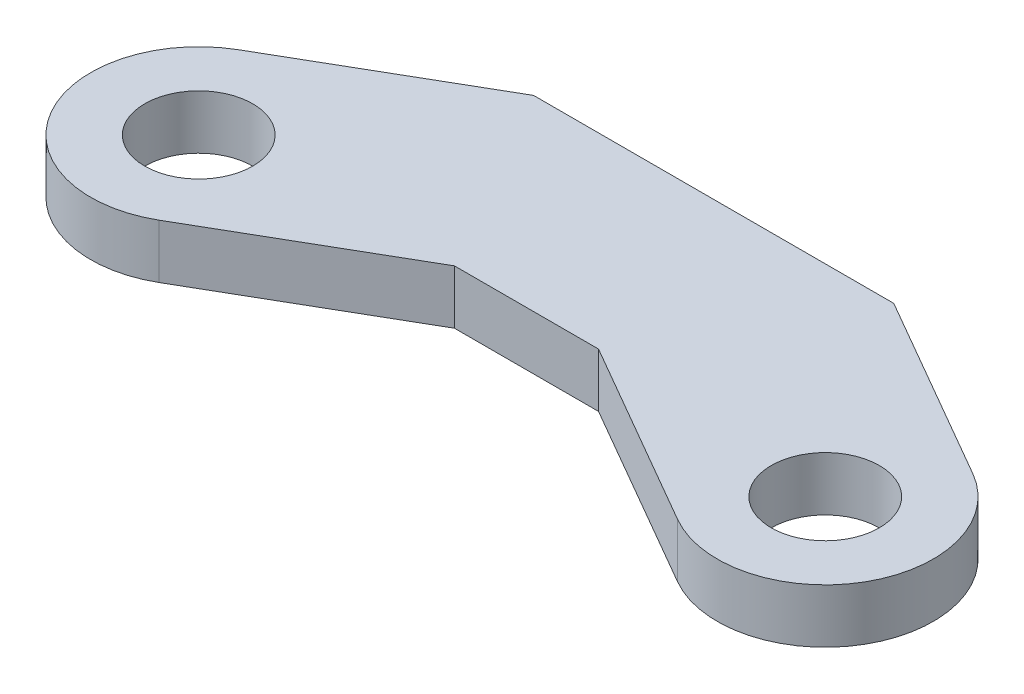
ISO-10303-21;
HEADER;
FILE_DESCRIPTION(('STEP AP214'),'2;1');
FILE_NAME('part.step','',(''),(''),'','','');
FILE_SCHEMA(('AUTOMOTIVE_DESIGN { 1 0 10303 214 1 1 1 1 }'));
ENDSEC;
DATA;
#1=APPLICATION_CONTEXT('core data for automotive mechanical design processes');
#2=APPLICATION_PROTOCOL_DEFINITION('international standard','automotive_design',2000,#1);
#3=PRODUCT_CONTEXT('',#1,'mechanical');
#4=PRODUCT('Part','Part','',(#3));
#5=PRODUCT_RELATED_PRODUCT_CATEGORY('part','',(#4));
#6=PRODUCT_DEFINITION_FORMATION('','',#4);
#7=PRODUCT_DEFINITION_CONTEXT('part definition',#1,'design');
#8=PRODUCT_DEFINITION('design','',#6,#7);
#9=PRODUCT_DEFINITION_SHAPE('','',#8);
#10=(LENGTH_UNIT() NAMED_UNIT(*) SI_UNIT(.MILLI.,.METRE.));
#11=(NAMED_UNIT(*) PLANE_ANGLE_UNIT() SI_UNIT($,.RADIAN.));
#12=(NAMED_UNIT(*) SI_UNIT($,.STERADIAN.) SOLID_ANGLE_UNIT());
#13=UNCERTAINTY_MEASURE_WITH_UNIT(LENGTH_MEASURE(1.E-05),#10,'distance_accuracy_value','');
#14=(GEOMETRIC_REPRESENTATION_CONTEXT(3) GLOBAL_UNCERTAINTY_ASSIGNED_CONTEXT((#13)) GLOBAL_UNIT_ASSIGNED_CONTEXT((#10,
#11,#12)) REPRESENTATION_CONTEXT('',''));
#15=CARTESIAN_POINT('',(0.,0.,0.));
#16=DIRECTION('',(0.,0.,1.));
#17=DIRECTION('',(1.,0.,0.));
#18=AXIS2_PLACEMENT_3D('',#15,#16,#17);
#19=CARTESIAN_POINT('',(5.23205080756885,1.5,7.59807621135335));
#20=DIRECTION('',(0.,1.,0.));
#21=DIRECTION('',(0.,0.,1.));
#22=AXIS2_PLACEMENT_3D('',#19,#20,#21);
#23=PLANE('',#22);
#24=CARTESIAN_POINT('',(5.23205080756885,1.5,7.59807621135335));
#25=DIRECTION('',(0.,1.,0.));
#26=DIRECTION('',(0.,0.,-1.));
#27=AXIS2_PLACEMENT_3D('',#24,#25,#26);
#28=CIRCLE('',#27,1.5);
#29=CARTESIAN_POINT('',(5.23205080756885,1.5,6.09807621135335));
#30=VERTEX_POINT('',#29);
#31=EDGE_CURVE('E135',#30,#30,#28,.T.);
#32=ORIENTED_EDGE('',*,*,#31,.F.);
#33=EDGE_LOOP('',(#32));
#34=FACE_BOUND('',#33,.T.);
#35=DIRECTION('',(-1.,0.,0.));
#36=VECTOR('',#35,1.);
#37=CARTESIAN_POINT('',(-8.46410161513776,1.5,2.00000000000001));
#38=LINE('',#37,#36);
#39=CARTESIAN_POINT('',(1.53589838486224,1.5,2.00000000000001));
#40=VERTEX_POINT('',#39);
#41=CARTESIAN_POINT('',(-8.46410161513776,1.5,2.00000000000001));
#42=VERTEX_POINT('',#41);
#43=EDGE_CURVE('E146',#40,#42,#38,.T.);
#44=ORIENTED_EDGE('',*,*,#43,.T.);
#45=DIRECTION('',(-0.866025403784439,0.,0.5));
#46=VECTOR('',#45,1.);
#47=CARTESIAN_POINT('',(-8.46410161513776,1.5,2.00000000000001));
#48=LINE('',#47,#46);
#49=CARTESIAN_POINT('',(-13.6602540378444,1.5,5.00000000000001));
#50=VERTEX_POINT('',#49);
#51=EDGE_CURVE('E94',#42,#50,#48,.T.);
#52=ORIENTED_EDGE('',*,*,#51,.T.);
#53=CARTESIAN_POINT('',(-12.1602540378444,1.5,7.59807621135335));
#54=DIRECTION('',(0.,1.,0.));
#55=DIRECTION('',(0.,0.,-1.));
#56=AXIS2_PLACEMENT_3D('',#53,#54,#55);
#57=CIRCLE('',#56,3.);
#58=CARTESIAN_POINT('',(-10.6602540378444,1.5,10.1961524227067));
#59=VERTEX_POINT('',#58);
#60=EDGE_CURVE('E161',#50,#59,#57,.T.);
#61=ORIENTED_EDGE('',*,*,#60,.T.);
#62=DIRECTION('',(0.866025403784439,0.,-0.5));
#63=VECTOR('',#62,1.);
#64=CARTESIAN_POINT('',(-5.46410161513776,1.5,7.19615242270664));
#65=LINE('',#64,#63);
#66=CARTESIAN_POINT('',(-5.46410161513776,1.5,7.19615242270664));
#67=VERTEX_POINT('',#66);
#68=EDGE_CURVE('E174',#59,#67,#65,.T.);
#69=ORIENTED_EDGE('',*,*,#68,.T.);
#70=DIRECTION('',(1.,0.,0.));
#71=VECTOR('',#70,1.);
#72=CARTESIAN_POINT('',(-5.46410161513776,1.5,7.19615242270664));
#73=LINE('',#72,#71);
#74=CARTESIAN_POINT('',(-1.46410161513776,1.5,7.19615242270664));
#75=VERTEX_POINT('',#74);
#76=EDGE_CURVE('E113',#67,#75,#73,.T.);
#77=ORIENTED_EDGE('',*,*,#76,.T.);
#78=DIRECTION('',(0.866025403784438,0.,0.500000000000001));
#79=VECTOR('',#78,1.);
#80=CARTESIAN_POINT('',(-1.46410161513776,1.5,7.19615242270664));
#81=LINE('',#80,#79);
#82=CARTESIAN_POINT('',(3.73205080756887,1.5,10.1961524227066));
#83=VERTEX_POINT('',#82);
#84=EDGE_CURVE('E107',#75,#83,#81,.T.);
#85=ORIENTED_EDGE('',*,*,#84,.T.);
#86=CARTESIAN_POINT('',(5.23205080756885,1.5,7.59807621135335));
#87=DIRECTION('',(0.,1.,0.));
#88=DIRECTION('',(0.,0.,1.));
#89=AXIS2_PLACEMENT_3D('',#86,#87,#88);
#90=CIRCLE('',#89,3.);
#91=CARTESIAN_POINT('',(6.73205080756885,1.5,5.00000000000003));
#92=VERTEX_POINT('',#91);
#93=EDGE_CURVE('E111',#83,#92,#90,.T.);
#94=ORIENTED_EDGE('',*,*,#93,.T.);
#95=DIRECTION('',(-0.866025403784438,0.,-0.500000000000001));
#96=VECTOR('',#95,1.);
#97=CARTESIAN_POINT('',(1.53589838486224,1.5,2.00000000000001));
#98=LINE('',#97,#96);
#99=EDGE_CURVE('E51',#92,#40,#98,.T.);
#100=ORIENTED_EDGE('',*,*,#99,.T.);
#101=EDGE_LOOP('',(#44,#52,#61,#69,#77,#85,#94,#100));
#102=FACE_BOUND('',#101,.T.);
#103=CARTESIAN_POINT('',(-12.1602540378444,1.5,7.59807621135335));
#104=DIRECTION('',(0.,1.,0.));
#105=DIRECTION('',(0.,0.,1.));
#106=AXIS2_PLACEMENT_3D('',#103,#104,#105);
#107=CIRCLE('',#106,1.5);
#108=CARTESIAN_POINT('',(-12.1602540378444,1.5,9.09807621135335));
#109=VERTEX_POINT('',#108);
#110=EDGE_CURVE('E183',#109,#109,#107,.T.);
#111=ORIENTED_EDGE('',*,*,#110,.F.);
#112=EDGE_LOOP('',(#111));
#113=FACE_BOUND('',#112,.T.);
#114=ADVANCED_FACE('F34',(#34,#102,#113),#23,.T.);
#115=CARTESIAN_POINT('',(5.23205080756885,0.,7.59807621135335));
#116=DIRECTION('',(0.,1.,0.));
#117=DIRECTION('',(0.,0.,1.));
#118=AXIS2_PLACEMENT_3D('',#115,#116,#117);
#119=PLANE('',#118);
#120=DIRECTION('',(-1.,0.,0.));
#121=VECTOR('',#120,1.);
#122=CARTESIAN_POINT('',(-8.46410161513776,0.,2.00000000000001));
#123=LINE('',#122,#121);
#124=CARTESIAN_POINT('',(1.53589838486224,0.,2.00000000000001));
#125=VERTEX_POINT('',#124);
#126=CARTESIAN_POINT('',(-8.46410161513776,0.,2.00000000000001));
#127=VERTEX_POINT('',#126);
#128=EDGE_CURVE('E131',#125,#127,#123,.T.);
#129=ORIENTED_EDGE('',*,*,#128,.F.);
#130=DIRECTION('',(-0.866025403784438,0.,-0.500000000000001));
#131=VECTOR('',#130,1.);
#132=CARTESIAN_POINT('',(1.53589838486224,0.,2.00000000000001));
#133=LINE('',#132,#131);
#134=CARTESIAN_POINT('',(6.73205080756885,0.,5.00000000000003));
#135=VERTEX_POINT('',#134);
#136=EDGE_CURVE('E86',#135,#125,#133,.T.);
#137=ORIENTED_EDGE('',*,*,#136,.F.);
#138=CARTESIAN_POINT('',(5.23205080756885,0.,7.59807621135335));
#139=DIRECTION('',(0.,1.,0.));
#140=DIRECTION('',(0.,0.,1.));
#141=AXIS2_PLACEMENT_3D('',#138,#139,#140);
#142=CIRCLE('',#141,3.);
#143=CARTESIAN_POINT('',(3.73205080756887,0.,10.1961524227066));
#144=VERTEX_POINT('',#143);
#145=EDGE_CURVE('E80',#144,#135,#142,.T.);
#146=ORIENTED_EDGE('',*,*,#145,.F.);
#147=DIRECTION('',(0.866025403784438,0.,0.500000000000001));
#148=VECTOR('',#147,1.);
#149=CARTESIAN_POINT('',(-1.46410161513776,0.,7.19615242270664));
#150=LINE('',#149,#148);
#151=CARTESIAN_POINT('',(-1.46410161513776,0.,7.19615242270664));
#152=VERTEX_POINT('',#151);
#153=EDGE_CURVE('E121',#152,#144,#150,.T.);
#154=ORIENTED_EDGE('',*,*,#153,.F.);
#155=DIRECTION('',(1.,0.,0.));
#156=VECTOR('',#155,1.);
#157=CARTESIAN_POINT('',(-5.46410161513776,0.,7.19615242270664));
#158=LINE('',#157,#156);
#159=CARTESIAN_POINT('',(-5.46410161513776,0.,7.19615242270664));
#160=VERTEX_POINT('',#159);
#161=EDGE_CURVE('E141',#160,#152,#158,.T.);
#162=ORIENTED_EDGE('',*,*,#161,.F.);
#163=DIRECTION('',(0.866025403784439,0.,-0.5));
#164=VECTOR('',#163,1.);
#165=CARTESIAN_POINT('',(-5.46410161513776,0.,7.19615242270664));
#166=LINE('',#165,#164);
#167=CARTESIAN_POINT('',(-10.6602540378444,0.,10.1961524227067));
#168=VERTEX_POINT('',#167);
#169=EDGE_CURVE('E139',#168,#160,#166,.T.);
#170=ORIENTED_EDGE('',*,*,#169,.F.);
#171=CARTESIAN_POINT('',(-12.1602540378444,0.,7.59807621135335));
#172=DIRECTION('',(0.,1.,0.));
#173=DIRECTION('',(0.,0.,-1.));
#174=AXIS2_PLACEMENT_3D('',#171,#172,#173);
#175=CIRCLE('',#174,3.);
#176=CARTESIAN_POINT('',(-13.6602540378444,0.,5.00000000000001));
#177=VERTEX_POINT('',#176);
#178=EDGE_CURVE('E137',#177,#168,#175,.T.);
#179=ORIENTED_EDGE('',*,*,#178,.F.);
#180=DIRECTION('',(-0.866025403784439,0.,0.5));
#181=VECTOR('',#180,1.);
#182=CARTESIAN_POINT('',(-8.46410161513776,0.,2.00000000000001));
#183=LINE('',#182,#181);
#184=EDGE_CURVE('E134',#127,#177,#183,.T.);
#185=ORIENTED_EDGE('',*,*,#184,.F.);
#186=EDGE_LOOP('',(#129,#137,#146,#154,#162,#170,#179,#185));
#187=FACE_BOUND('',#186,.T.);
#188=CARTESIAN_POINT('',(5.23205080756885,0.,7.59807621135335));
#189=DIRECTION('',(0.,1.,0.));
#190=DIRECTION('',(0.,0.,-1.));
#191=AXIS2_PLACEMENT_3D('',#188,#189,#190);
#192=CIRCLE('',#191,1.5);
#193=CARTESIAN_POINT('',(5.23205080756885,0.,6.09807621135335));
#194=VERTEX_POINT('',#193);
#195=EDGE_CURVE('E180',#194,#194,#192,.T.);
#196=ORIENTED_EDGE('',*,*,#195,.T.);
#197=EDGE_LOOP('',(#196));
#198=FACE_BOUND('',#197,.T.);
#199=CARTESIAN_POINT('',(-12.1602540378444,0.,7.59807621135335));
#200=DIRECTION('',(0.,1.,0.));
#201=DIRECTION('',(0.,0.,1.));
#202=AXIS2_PLACEMENT_3D('',#199,#200,#201);
#203=CIRCLE('',#202,1.5);
#204=CARTESIAN_POINT('',(-12.1602540378444,0.,9.09807621135335));
#205=VERTEX_POINT('',#204);
#206=EDGE_CURVE('E186',#205,#205,#203,.T.);
#207=ORIENTED_EDGE('',*,*,#206,.T.);
#208=EDGE_LOOP('',(#207));
#209=FACE_BOUND('',#208,.T.);
#210=ADVANCED_FACE('F165',(#187,#198,#209),#119,.F.);
#211=CARTESIAN_POINT('',(-8.46410161513776,1.5,2.00000000000001));
#212=DIRECTION('',(0.,0.,1.));
#213=DIRECTION('',(1.,0.,0.));
#214=AXIS2_PLACEMENT_3D('',#211,#212,#213);
#215=PLANE('',#214);
#216=ORIENTED_EDGE('',*,*,#128,.T.);
#217=DIRECTION('',(0.,-1.,0.));
#218=VECTOR('',#217,1.);
#219=CARTESIAN_POINT('',(-8.46410161513776,1.5,2.00000000000001));
#220=LINE('',#219,#218);
#221=EDGE_CURVE('E11',#42,#127,#220,.T.);
#222=ORIENTED_EDGE('',*,*,#221,.F.);
#223=ORIENTED_EDGE('',*,*,#43,.F.);
#224=DIRECTION('',(0.,-1.,0.));
#225=VECTOR('',#224,1.);
#226=CARTESIAN_POINT('',(1.53589838486224,1.5,2.00000000000001));
#227=LINE('',#226,#225);
#228=EDGE_CURVE('E127',#40,#125,#227,.T.);
#229=ORIENTED_EDGE('',*,*,#228,.T.);
#230=EDGE_LOOP('',(#216,#222,#223,#229));
#231=FACE_BOUND('',#230,.T.);
#232=ADVANCED_FACE('F36',(#231),#215,.F.);
#233=CARTESIAN_POINT('',(-8.46410161513776,1.5,2.00000000000001));
#234=DIRECTION('',(0.5,0.,0.866025403784438));
#235=DIRECTION('',(0.866025403784439,0.,-0.5));
#236=AXIS2_PLACEMENT_3D('',#233,#234,#235);
#237=PLANE('',#236);
#238=ORIENTED_EDGE('',*,*,#184,.T.);
#239=DIRECTION('',(0.,-1.,0.));
#240=VECTOR('',#239,1.);
#241=CARTESIAN_POINT('',(-13.6602540378444,1.5,5.00000000000001));
#242=LINE('',#241,#240);
#243=EDGE_CURVE('E43',#50,#177,#242,.T.);
#244=ORIENTED_EDGE('',*,*,#243,.F.);
#245=ORIENTED_EDGE('',*,*,#51,.F.);
#246=ORIENTED_EDGE('',*,*,#221,.T.);
#247=EDGE_LOOP('',(#238,#244,#245,#246));
#248=FACE_BOUND('',#247,.T.);
#249=ADVANCED_FACE('F218',(#248),#237,.F.);
#250=CARTESIAN_POINT('',(-12.1602540378444,1.5,7.59807621135335));
#251=DIRECTION('',(0.,-1.,0.));
#252=DIRECTION('',(0.,0.,-1.));
#253=AXIS2_PLACEMENT_3D('',#250,#251,#252);
#254=CYLINDRICAL_SURFACE('',#253,3.);
#255=ORIENTED_EDGE('',*,*,#178,.T.);
#256=DIRECTION('',(0.,-1.,0.));
#257=VECTOR('',#256,1.);
#258=CARTESIAN_POINT('',(-10.6602540378444,1.5,10.1961524227067));
#259=LINE('',#258,#257);
#260=EDGE_CURVE('E153',#59,#168,#259,.T.);
#261=ORIENTED_EDGE('',*,*,#260,.F.);
#262=ORIENTED_EDGE('',*,*,#60,.F.);
#263=ORIENTED_EDGE('',*,*,#243,.T.);
#264=EDGE_LOOP('',(#255,#261,#262,#263));
#265=FACE_BOUND('',#264,.T.);
#266=ADVANCED_FACE('F159',(#265),#254,.T.);
#267=CARTESIAN_POINT('',(-5.46410161513776,1.5,7.19615242270664));
#268=DIRECTION('',(-0.5,0.,-0.866025403784438));
#269=DIRECTION('',(-0.866025403784439,0.,0.5));
#270=AXIS2_PLACEMENT_3D('',#267,#268,#269);
#271=PLANE('',#270);
#272=ORIENTED_EDGE('',*,*,#169,.T.);
#273=DIRECTION('',(0.,-1.,0.));
#274=VECTOR('',#273,1.);
#275=CARTESIAN_POINT('',(-5.46410161513776,1.5,7.19615242270664));
#276=LINE('',#275,#274);
#277=EDGE_CURVE('E150',#67,#160,#276,.T.);
#278=ORIENTED_EDGE('',*,*,#277,.F.);
#279=ORIENTED_EDGE('',*,*,#68,.F.);
#280=ORIENTED_EDGE('',*,*,#260,.T.);
#281=EDGE_LOOP('',(#272,#278,#279,#280));
#282=FACE_BOUND('',#281,.T.);
#283=ADVANCED_FACE('F170',(#282),#271,.F.);
#284=CARTESIAN_POINT('',(-5.46410161513776,1.5,7.19615242270664));
#285=DIRECTION('',(0.,0.,-1.));
#286=DIRECTION('',(-1.,0.,0.));
#287=AXIS2_PLACEMENT_3D('',#284,#285,#286);
#288=PLANE('',#287);
#289=ORIENTED_EDGE('',*,*,#161,.T.);
#290=DIRECTION('',(0.,-1.,0.));
#291=VECTOR('',#290,1.);
#292=CARTESIAN_POINT('',(-1.46410161513776,1.5,7.19615242270664));
#293=LINE('',#292,#291);
#294=EDGE_CURVE('E122',#75,#152,#293,.T.);
#295=ORIENTED_EDGE('',*,*,#294,.F.);
#296=ORIENTED_EDGE('',*,*,#76,.F.);
#297=ORIENTED_EDGE('',*,*,#277,.T.);
#298=EDGE_LOOP('',(#289,#295,#296,#297));
#299=FACE_BOUND('',#298,.T.);
#300=ADVANCED_FACE('F173',(#299),#288,.F.);
#301=CARTESIAN_POINT('',(-1.46410161513776,1.5,7.19615242270664));
#302=DIRECTION('',(0.500000000000001,0.,-0.866025403784438));
#303=DIRECTION('',(-0.866025403784438,0.,-0.500000000000001));
#304=AXIS2_PLACEMENT_3D('',#301,#302,#303);
#305=PLANE('',#304);
#306=ORIENTED_EDGE('',*,*,#153,.T.);
#307=DIRECTION('',(0.,-1.,0.));
#308=VECTOR('',#307,1.);
#309=CARTESIAN_POINT('',(3.73205080756887,1.5,10.1961524227066));
#310=LINE('',#309,#308);
#311=EDGE_CURVE('E118',#83,#144,#310,.T.);
#312=ORIENTED_EDGE('',*,*,#311,.F.);
#313=ORIENTED_EDGE('',*,*,#84,.F.);
#314=ORIENTED_EDGE('',*,*,#294,.T.);
#315=EDGE_LOOP('',(#306,#312,#313,#314));
#316=FACE_BOUND('',#315,.T.);
#317=ADVANCED_FACE('F119',(#316),#305,.F.);
#318=CARTESIAN_POINT('',(5.23205080756885,1.5,7.59807621135335));
#319=DIRECTION('',(0.,-1.,0.));
#320=DIRECTION('',(0.,0.,-1.));
#321=AXIS2_PLACEMENT_3D('',#318,#319,#320);
#322=CYLINDRICAL_SURFACE('',#321,3.);
#323=ORIENTED_EDGE('',*,*,#145,.T.);
#324=DIRECTION('',(0.,-1.,0.));
#325=VECTOR('',#324,1.);
#326=CARTESIAN_POINT('',(6.73205080756885,1.5,5.00000000000003));
#327=LINE('',#326,#325);
#328=EDGE_CURVE('E123',#92,#135,#327,.T.);
#329=ORIENTED_EDGE('',*,*,#328,.F.);
#330=ORIENTED_EDGE('',*,*,#93,.F.);
#331=ORIENTED_EDGE('',*,*,#311,.T.);
#332=EDGE_LOOP('',(#323,#329,#330,#331));
#333=FACE_BOUND('',#332,.T.);
#334=ADVANCED_FACE('F125',(#333),#322,.T.);
#335=CARTESIAN_POINT('',(1.53589838486224,1.5,2.00000000000001));
#336=DIRECTION('',(-0.500000000000001,0.,0.866025403784438));
#337=DIRECTION('',(0.866025403784438,0.,0.500000000000001));
#338=AXIS2_PLACEMENT_3D('',#335,#336,#337);
#339=PLANE('',#338);
#340=ORIENTED_EDGE('',*,*,#136,.T.);
#341=ORIENTED_EDGE('',*,*,#228,.F.);
#342=ORIENTED_EDGE('',*,*,#99,.F.);
#343=ORIENTED_EDGE('',*,*,#328,.T.);
#344=EDGE_LOOP('',(#340,#341,#342,#343));
#345=FACE_BOUND('',#344,.T.);
#346=ADVANCED_FACE('F206',(#345),#339,.F.);
#347=CARTESIAN_POINT('',(5.23205080756885,1.5,7.59807621135335));
#348=DIRECTION('',(0.,-1.,0.));
#349=DIRECTION('',(0.,0.,-1.));
#350=AXIS2_PLACEMENT_3D('',#347,#348,#349);
#351=CYLINDRICAL_SURFACE('',#350,1.5);
#352=ORIENTED_EDGE('',*,*,#31,.T.);
#353=EDGE_LOOP('',(#352));
#354=FACE_BOUND('',#353,.T.);
#355=ORIENTED_EDGE('',*,*,#195,.F.);
#356=EDGE_LOOP('',(#355));
#357=FACE_BOUND('',#356,.T.);
#358=ADVANCED_FACE('F203',(#354,#357),#351,.F.);
#359=CARTESIAN_POINT('',(-12.1602540378444,1.5,7.59807621135335));
#360=DIRECTION('',(0.,-1.,0.));
#361=DIRECTION('',(0.,0.,-1.));
#362=AXIS2_PLACEMENT_3D('',#359,#360,#361);
#363=CYLINDRICAL_SURFACE('',#362,1.5);
#364=ORIENTED_EDGE('',*,*,#110,.T.);
#365=EDGE_LOOP('',(#364));
#366=FACE_BOUND('',#365,.T.);
#367=ORIENTED_EDGE('',*,*,#206,.F.);
#368=EDGE_LOOP('',(#367));
#369=FACE_BOUND('',#368,.T.);
#370=ADVANCED_FACE('F192',(#366,#369),#363,.F.);
#371=CLOSED_SHELL('',(#114,#210,#232,#249,#266,#283,#300,#317,#334,#346,#358,#370));
#372=MANIFOLD_SOLID_BREP('B2',#371);
#373=ADVANCED_BREP_SHAPE_REPRESENTATION('',(#18,#372),#14);
#374=SHAPE_DEFINITION_REPRESENTATION(#9,#373);
ENDSEC;
END-ISO-10303-21;
